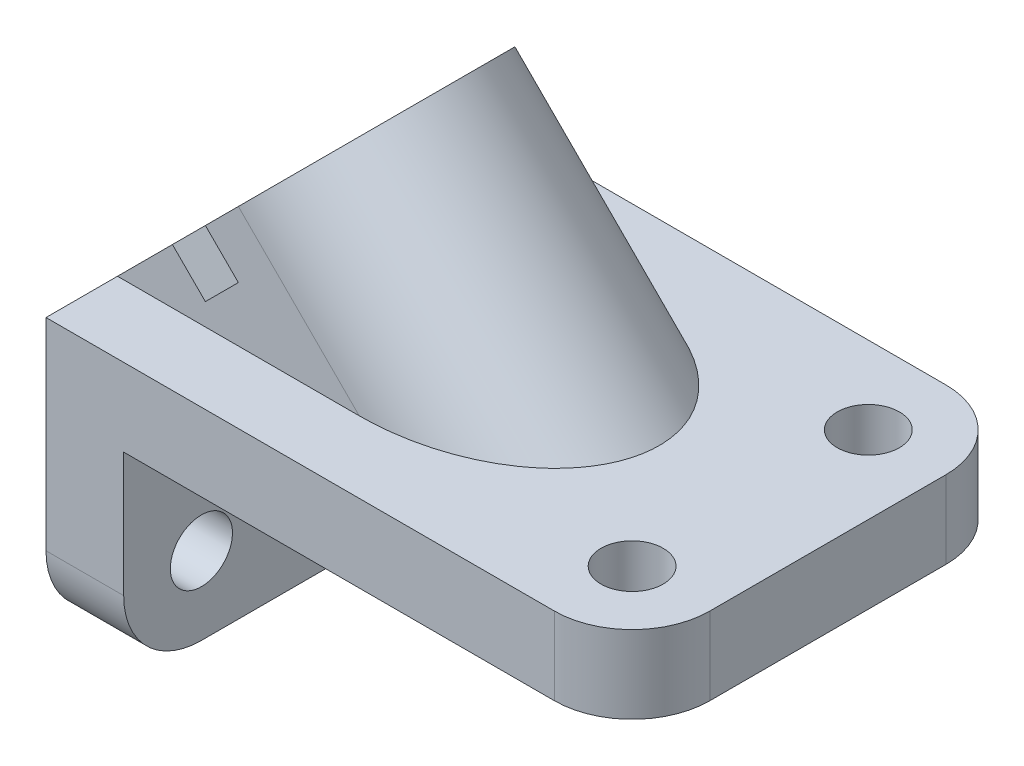
ISO-10303-21;
HEADER;
FILE_DESCRIPTION(('STEP AP214'),'2;1');
FILE_NAME('part.step','',(''),(''),'','','');
FILE_SCHEMA(('AUTOMOTIVE_DESIGN { 1 0 10303 214 1 1 1 1 }'));
ENDSEC;
DATA;
#1=APPLICATION_CONTEXT('core data for automotive mechanical design processes');
#2=APPLICATION_PROTOCOL_DEFINITION('international standard','automotive_design',2000,#1);
#3=PRODUCT_CONTEXT('',#1,'mechanical');
#4=PRODUCT('Part','Part','',(#3));
#5=PRODUCT_RELATED_PRODUCT_CATEGORY('part','',(#4));
#6=PRODUCT_DEFINITION_FORMATION('','',#4);
#7=PRODUCT_DEFINITION_CONTEXT('part definition',#1,'design');
#8=PRODUCT_DEFINITION('design','',#6,#7);
#9=PRODUCT_DEFINITION_SHAPE('','',#8);
#10=(LENGTH_UNIT() NAMED_UNIT(*) SI_UNIT(.MILLI.,.METRE.));
#11=(NAMED_UNIT(*) PLANE_ANGLE_UNIT() SI_UNIT($,.RADIAN.));
#12=(NAMED_UNIT(*) SI_UNIT($,.STERADIAN.) SOLID_ANGLE_UNIT());
#13=UNCERTAINTY_MEASURE_WITH_UNIT(LENGTH_MEASURE(1.E-05),#10,'distance_accuracy_value','');
#14=(GEOMETRIC_REPRESENTATION_CONTEXT(3) GLOBAL_UNCERTAINTY_ASSIGNED_CONTEXT((#13)) GLOBAL_UNIT_ASSIGNED_CONTEXT((#10,
#11,#12)) REPRESENTATION_CONTEXT('',''));
#15=CARTESIAN_POINT('',(0.,0.,0.));
#16=DIRECTION('',(0.,0.,1.));
#17=DIRECTION('',(1.,0.,0.));
#18=AXIS2_PLACEMENT_3D('',#15,#16,#17);
#19=CARTESIAN_POINT('',(-100.212765957447,0.,40.));
#20=DIRECTION('',(0.707106781186544,-0.707106781186551,0.));
#21=DIRECTION('',(0.707106781186551,0.707106781186544,0.));
#22=AXIS2_PLACEMENT_3D('',#19,#20,#21);
#23=PLANE('',#22);
#24=CARTESIAN_POINT('',(-47.1797573684554,53.0330085889908,0.));
#25=DIRECTION('',(-0.707106781186544,0.707106781186551,0.));
#26=DIRECTION('',(-0.707106781186551,-0.707106781186544,0.));
#27=AXIS2_PLACEMENT_3D('',#24,#25,#26);
#28=CIRCLE('',#27,15.);
#29=CARTESIAN_POINT('',(-57.7863590862537,42.4264068711926,0.));
#30=VERTEX_POINT('',#29);
#31=EDGE_CURVE('E319',#30,#30,#28,.T.);
#32=ORIENTED_EDGE('',*,*,#31,.F.);
#33=EDGE_LOOP('',(#32));
#34=FACE_BOUND('',#33,.T.);
#35=DIRECTION('',(-0.707106781186551,-0.707106781186544,0.));
#36=VECTOR('',#35,1.);
#37=CARTESIAN_POINT('',(-100.212765957447,0.,-40.));
#38=LINE('',#37,#36);
#39=CARTESIAN_POINT('',(-61.3218929921865,38.8908729652599,-40.));
#40=VERTEX_POINT('',#39);
#41=CARTESIAN_POINT('',(-71.9284947099848,28.2842712474618,-40.));
#42=VERTEX_POINT('',#41);
#43=EDGE_CURVE('E189',#40,#42,#38,.T.);
#44=ORIENTED_EDGE('',*,*,#43,.T.);
#45=DIRECTION('',(0.,0.,1.));
#46=VECTOR('',#45,1.);
#47=CARTESIAN_POINT('',(-71.9284947099848,28.2842712474618,-50.));
#48=LINE('',#47,#46);
#49=CARTESIAN_POINT('',(-71.9284947099848,28.2842712474618,40.));
#50=VERTEX_POINT('',#49);
#51=EDGE_CURVE('E321',#42,#50,#48,.T.);
#52=ORIENTED_EDGE('',*,*,#51,.T.);
#53=DIRECTION('',(-0.707106781186551,-0.707106781186544,0.));
#54=VECTOR('',#53,1.);
#55=CARTESIAN_POINT('',(-100.212765957447,0.,40.));
#56=LINE('',#55,#54);
#57=CARTESIAN_POINT('',(-61.3218929921865,38.8908729652599,40.));
#58=VERTEX_POINT('',#57);
#59=EDGE_CURVE('E176',#58,#50,#56,.T.);
#60=ORIENTED_EDGE('',*,*,#59,.F.);
#61=CARTESIAN_POINT('',(-61.3218929921865,38.8908729652599,0.));
#62=DIRECTION('',(-0.707106781186544,0.707106781186551,0.));
#63=DIRECTION('',(-0.707106781186551,-0.707106781186544,0.));
#64=AXIS2_PLACEMENT_3D('',#61,#62,#63);
#65=CIRCLE('',#64,40.);
#66=EDGE_CURVE('E313',#58,#40,#65,.T.);
#67=ORIENTED_EDGE('',*,*,#66,.T.);
#68=EDGE_LOOP('',(#44,#52,#60,#67));
#69=FACE_BOUND('',#68,.T.);
#70=ADVANCED_FACE('F33',(#34,#69),#23,.F.);
#71=CARTESIAN_POINT('',(-100.212765957447,-90.,63.));
#72=DIRECTION('',(0.,1.,0.));
#73=DIRECTION('',(0.,0.,1.));
#74=AXIS2_PLACEMENT_3D('',#71,#72,#73);
#75=PLANE('',#74);
#76=DIRECTION('',(0.,0.,-1.));
#77=VECTOR('',#76,1.);
#78=CARTESIAN_POINT('',(-100.212765957447,-90.,63.));
#79=LINE('',#78,#77);
#80=CARTESIAN_POINT('',(-100.212765957447,-90.,38.));
#81=VERTEX_POINT('',#80);
#82=CARTESIAN_POINT('',(-100.212765957447,-90.,-38.));
#83=VERTEX_POINT('',#82);
#84=EDGE_CURVE('E223',#81,#83,#79,.T.);
#85=ORIENTED_EDGE('',*,*,#84,.T.);
#86=DIRECTION('',(1.,0.,0.));
#87=VECTOR('',#86,1.);
#88=CARTESIAN_POINT('',(-100.212765957447,-90.,-38.));
#89=LINE('',#88,#87);
#90=CARTESIAN_POINT('',(-75.2127659574468,-90.,-38.));
#91=VERTEX_POINT('',#90);
#92=EDGE_CURVE('E255',#83,#91,#89,.T.);
#93=ORIENTED_EDGE('',*,*,#92,.T.);
#94=DIRECTION('',(0.,0.,-1.));
#95=VECTOR('',#94,1.);
#96=CARTESIAN_POINT('',(-75.2127659574468,-90.,63.));
#97=LINE('',#96,#95);
#98=CARTESIAN_POINT('',(-75.2127659574468,-90.,38.));
#99=VERTEX_POINT('',#98);
#100=EDGE_CURVE('E250',#99,#91,#97,.T.);
#101=ORIENTED_EDGE('',*,*,#100,.F.);
#102=DIRECTION('',(1.,0.,0.));
#103=VECTOR('',#102,1.);
#104=CARTESIAN_POINT('',(-100.212765957447,-90.,38.));
#105=LINE('',#104,#103);
#106=EDGE_CURVE('E253',#99,#81,#105,.F.);
#107=ORIENTED_EDGE('',*,*,#106,.T.);
#108=EDGE_LOOP('',(#85,#93,#101,#107));
#109=FACE_BOUND('',#108,.T.);
#110=ADVANCED_FACE('F347',(#109),#75,.F.);
#111=CARTESIAN_POINT('',(-75.2127659574468,-90.,63.));
#112=DIRECTION('',(-1.,0.,0.));
#113=DIRECTION('',(0.,0.,1.));
#114=AXIS2_PLACEMENT_3D('',#111,#112,#113);
#115=PLANE('',#114);
#116=CARTESIAN_POINT('',(-75.2127659574468,-65.,-38.));
#117=DIRECTION('',(-1.,0.,0.));
#118=DIRECTION('',(0.,0.,1.));
#119=AXIS2_PLACEMENT_3D('',#116,#117,#118);
#120=CIRCLE('',#119,10.);
#121=CARTESIAN_POINT('',(-75.2127659574468,-65.,-28.));
#122=VERTEX_POINT('',#121);
#123=EDGE_CURVE('E202',#122,#122,#120,.T.);
#124=ORIENTED_EDGE('',*,*,#123,.T.);
#125=EDGE_LOOP('',(#124));
#126=FACE_BOUND('',#125,.T.);
#127=CARTESIAN_POINT('',(-75.2127659574468,-65.,38.));
#128=DIRECTION('',(-1.,0.,0.));
#129=DIRECTION('',(0.,0.,1.));
#130=AXIS2_PLACEMENT_3D('',#127,#128,#129);
#131=CIRCLE('',#130,10.);
#132=CARTESIAN_POINT('',(-75.2127659574468,-65.,48.));
#133=VERTEX_POINT('',#132);
#134=EDGE_CURVE('E197',#133,#133,#131,.T.);
#135=ORIENTED_EDGE('',*,*,#134,.T.);
#136=EDGE_LOOP('',(#135));
#137=FACE_BOUND('',#136,.T.);
#138=ORIENTED_EDGE('',*,*,#100,.T.);
#139=CARTESIAN_POINT('',(-75.2127659574468,-65.,-38.));
#140=DIRECTION('',(-1.,0.,0.));
#141=DIRECTION('',(0.,0.,1.));
#142=AXIS2_PLACEMENT_3D('',#139,#140,#141);
#143=CIRCLE('',#142,25.);
#144=CARTESIAN_POINT('',(-75.2127659574468,-65.,-63.));
#145=VERTEX_POINT('',#144);
#146=EDGE_CURVE('E260',#91,#145,#143,.F.);
#147=ORIENTED_EDGE('',*,*,#146,.T.);
#148=DIRECTION('',(0.,1.,0.));
#149=VECTOR('',#148,1.);
#150=CARTESIAN_POINT('',(-75.2127659574468,-90.,-63.));
#151=LINE('',#150,#149);
#152=CARTESIAN_POINT('',(-75.2127659574468,-25.,-63.));
#153=VERTEX_POINT('',#152);
#154=EDGE_CURVE('E224',#145,#153,#151,.T.);
#155=ORIENTED_EDGE('',*,*,#154,.T.);
#156=DIRECTION('',(0.,0.,-1.));
#157=VECTOR('',#156,1.);
#158=CARTESIAN_POINT('',(-75.2127659574468,-25.,63.));
#159=LINE('',#158,#157);
#160=CARTESIAN_POINT('',(-75.2127659574468,-25.,63.));
#161=VERTEX_POINT('',#160);
#162=EDGE_CURVE('E247',#161,#153,#159,.T.);
#163=ORIENTED_EDGE('',*,*,#162,.F.);
#164=DIRECTION('',(0.,1.,0.));
#165=VECTOR('',#164,1.);
#166=CARTESIAN_POINT('',(-75.2127659574468,-90.,63.));
#167=LINE('',#166,#165);
#168=CARTESIAN_POINT('',(-75.2127659574468,-65.,63.));
#169=VERTEX_POINT('',#168);
#170=EDGE_CURVE('E212',#169,#161,#167,.T.);
#171=ORIENTED_EDGE('',*,*,#170,.F.);
#172=CARTESIAN_POINT('',(-75.2127659574468,-65.,38.));
#173=DIRECTION('',(-1.,0.,0.));
#174=DIRECTION('',(0.,0.,1.));
#175=AXIS2_PLACEMENT_3D('',#172,#173,#174);
#176=CIRCLE('',#175,25.);
#177=EDGE_CURVE('E258',#169,#99,#176,.F.);
#178=ORIENTED_EDGE('',*,*,#177,.T.);
#179=EDGE_LOOP('',(#138,#147,#155,#163,#171,#178));
#180=FACE_BOUND('',#179,.T.);
#181=ADVANCED_FACE('F353',(#126,#137,#180),#115,.F.);
#182=CARTESIAN_POINT('',(-75.2127659574468,-25.,63.));
#183=DIRECTION('',(0.,1.,0.));
#184=DIRECTION('',(0.,0.,1.));
#185=AXIS2_PLACEMENT_3D('',#182,#183,#184);
#186=PLANE('',#185);
#187=CARTESIAN_POINT('',(30.8532512205345,-25.,0.));
#188=DIRECTION('',(0.,1.,0.));
#189=DIRECTION('',(-1.,0.,0.));
#190=AXIS2_PLACEMENT_3D('',#187,#188,#189);
#191=ELLIPSE('',#190,21.2132034355963,15.);
#192=CARTESIAN_POINT('',(9.64004778493821,-25.,0.));
#193=VERTEX_POINT('',#192);
#194=EDGE_CURVE('E316',#193,#193,#191,.T.);
#195=ORIENTED_EDGE('',*,*,#194,.T.);
#196=EDGE_LOOP('',(#195));
#197=FACE_BOUND('',#196,.T.);
#198=CARTESIAN_POINT('',(63.3720886884021,-25.,-38.));
#199=DIRECTION('',(0.,-1.,0.));
#200=DIRECTION('',(0.,0.,-1.));
#201=AXIS2_PLACEMENT_3D('',#198,#199,#200);
#202=CIRCLE('',#201,10.);
#203=CARTESIAN_POINT('',(63.3720886884021,-25.,-48.));
#204=VERTEX_POINT('',#203);
#205=EDGE_CURVE('E206',#204,#204,#202,.T.);
#206=ORIENTED_EDGE('',*,*,#205,.F.);
#207=EDGE_LOOP('',(#206));
#208=FACE_BOUND('',#207,.T.);
#209=CARTESIAN_POINT('',(63.3720886884021,-25.,38.));
#210=DIRECTION('',(0.,-1.,0.));
#211=DIRECTION('',(0.,0.,-1.));
#212=AXIS2_PLACEMENT_3D('',#209,#210,#211);
#213=CIRCLE('',#212,10.);
#214=CARTESIAN_POINT('',(63.3720886884021,-25.,28.));
#215=VERTEX_POINT('',#214);
#216=EDGE_CURVE('E205',#215,#215,#213,.T.);
#217=ORIENTED_EDGE('',*,*,#216,.F.);
#218=EDGE_LOOP('',(#217));
#219=FACE_BOUND('',#218,.T.);
#220=DIRECTION('',(1.,0.,0.));
#221=VECTOR('',#220,1.);
#222=CARTESIAN_POINT('',(-75.2127659574468,-25.,-63.));
#223=LINE('',#222,#221);
#224=CARTESIAN_POINT('',(63.3720886884021,-25.,-63.));
#225=VERTEX_POINT('',#224);
#226=EDGE_CURVE('E226',#153,#225,#223,.T.);
#227=ORIENTED_EDGE('',*,*,#226,.T.);
#228=CARTESIAN_POINT('',(63.3720886884021,-25.,-38.));
#229=DIRECTION('',(0.,1.,0.));
#230=DIRECTION('',(0.,0.,1.));
#231=AXIS2_PLACEMENT_3D('',#228,#229,#230);
#232=CIRCLE('',#231,25.);
#233=CARTESIAN_POINT('',(88.3720886884021,-25.,-38.));
#234=VERTEX_POINT('',#233);
#235=EDGE_CURVE('E287',#225,#234,#232,.F.);
#236=ORIENTED_EDGE('',*,*,#235,.T.);
#237=DIRECTION('',(0.,0.,-1.));
#238=VECTOR('',#237,1.);
#239=CARTESIAN_POINT('',(88.3720886884021,-25.,63.));
#240=LINE('',#239,#238);
#241=CARTESIAN_POINT('',(88.3720886884021,-25.,38.));
#242=VERTEX_POINT('',#241);
#243=EDGE_CURVE('E244',#242,#234,#240,.T.);
#244=ORIENTED_EDGE('',*,*,#243,.F.);
#245=CARTESIAN_POINT('',(63.3720886884021,-25.,38.));
#246=DIRECTION('',(0.,1.,0.));
#247=DIRECTION('',(0.,0.,1.));
#248=AXIS2_PLACEMENT_3D('',#245,#246,#247);
#249=CIRCLE('',#248,25.);
#250=CARTESIAN_POINT('',(63.3720886884021,-25.,63.));
#251=VERTEX_POINT('',#250);
#252=EDGE_CURVE('E285',#242,#251,#249,.F.);
#253=ORIENTED_EDGE('',*,*,#252,.T.);
#254=DIRECTION('',(1.,0.,0.));
#255=VECTOR('',#254,1.);
#256=CARTESIAN_POINT('',(-75.2127659574468,-25.,63.));
#257=LINE('',#256,#255);
#258=EDGE_CURVE('E214',#161,#251,#257,.T.);
#259=ORIENTED_EDGE('',*,*,#258,.F.);
#260=ORIENTED_EDGE('',*,*,#162,.T.);
#261=EDGE_LOOP('',(#227,#236,#244,#253,#259,#260));
#262=FACE_BOUND('',#261,.T.);
#263=ADVANCED_FACE('F399',(#197,#208,#219,#262),#186,.F.);
#264=CARTESIAN_POINT('',(88.3720886884021,-25.,63.));
#265=DIRECTION('',(-1.,0.,0.));
#266=DIRECTION('',(0.,0.,1.));
#267=AXIS2_PLACEMENT_3D('',#264,#265,#266);
#268=PLANE('',#267);
#269=ORIENTED_EDGE('',*,*,#243,.T.);
#270=DIRECTION('',(0.,1.,0.));
#271=VECTOR('',#270,1.);
#272=CARTESIAN_POINT('',(88.3720886884021,-25.,-38.));
#273=LINE('',#272,#271);
#274=CARTESIAN_POINT('',(88.3720886884021,0.,-38.));
#275=VERTEX_POINT('',#274);
#276=EDGE_CURVE('E278',#234,#275,#273,.T.);
#277=ORIENTED_EDGE('',*,*,#276,.T.);
#278=DIRECTION('',(0.,0.,-1.));
#279=VECTOR('',#278,1.);
#280=CARTESIAN_POINT('',(88.3720886884021,0.,63.));
#281=LINE('',#280,#279);
#282=CARTESIAN_POINT('',(88.3720886884021,0.,38.));
#283=VERTEX_POINT('',#282);
#284=EDGE_CURVE('E241',#283,#275,#281,.T.);
#285=ORIENTED_EDGE('',*,*,#284,.F.);
#286=DIRECTION('',(0.,1.,0.));
#287=VECTOR('',#286,1.);
#288=CARTESIAN_POINT('',(88.3720886884021,-25.,38.));
#289=LINE('',#288,#287);
#290=EDGE_CURVE('E276',#283,#242,#289,.F.);
#291=ORIENTED_EDGE('',*,*,#290,.T.);
#292=EDGE_LOOP('',(#269,#277,#285,#291));
#293=FACE_BOUND('',#292,.T.);
#294=ADVANCED_FACE('F395',(#293),#268,.F.);
#295=CARTESIAN_POINT('',(-100.212765957447,0.,63.));
#296=DIRECTION('',(0.,-1.,0.));
#297=DIRECTION('',(0.,0.,-1.));
#298=AXIS2_PLACEMENT_3D('',#295,#296,#297);
#299=PLANE('',#298);
#300=CARTESIAN_POINT('',(63.3720886884021,0.,-38.));
#301=DIRECTION('',(0.,-1.,0.));
#302=DIRECTION('',(0.,0.,-1.));
#303=AXIS2_PLACEMENT_3D('',#300,#301,#302);
#304=CIRCLE('',#303,10.);
#305=CARTESIAN_POINT('',(63.3720886884021,0.,-48.));
#306=VERTEX_POINT('',#305);
#307=EDGE_CURVE('E227',#306,#306,#304,.T.);
#308=ORIENTED_EDGE('',*,*,#307,.T.);
#309=EDGE_LOOP('',(#308));
#310=FACE_BOUND('',#309,.T.);
#311=CARTESIAN_POINT('',(63.3720886884021,0.,38.));
#312=DIRECTION('',(0.,-1.,0.));
#313=DIRECTION('',(0.,0.,-1.));
#314=AXIS2_PLACEMENT_3D('',#311,#312,#313);
#315=CIRCLE('',#314,10.);
#316=CARTESIAN_POINT('',(63.3720886884021,0.,28.));
#317=VERTEX_POINT('',#316);
#318=EDGE_CURVE('E209',#317,#317,#315,.T.);
#319=ORIENTED_EDGE('',*,*,#318,.T.);
#320=EDGE_LOOP('',(#319));
#321=FACE_BOUND('',#320,.T.);
#322=DIRECTION('',(1.,0.,0.));
#323=VECTOR('',#322,1.);
#324=CARTESIAN_POINT('',(-22.4310200269256,0.,-40.));
#325=LINE('',#324,#323);
#326=CARTESIAN_POINT('',(-100.212765957447,0.,-40.));
#327=VERTEX_POINT('',#326);
#328=CARTESIAN_POINT('',(-22.4310200269256,0.,-40.));
#329=VERTEX_POINT('',#328);
#330=EDGE_CURVE('E56',#327,#329,#325,.T.);
#331=ORIENTED_EDGE('',*,*,#330,.T.);
#332=CARTESIAN_POINT('',(-22.431020026927,0.,0.));
#333=DIRECTION('',(0.,-1.,0.));
#334=DIRECTION('',(-1.,0.,0.));
#335=AXIS2_PLACEMENT_3D('',#332,#333,#334);
#336=ELLIPSE('',#335,56.5685424949235,40.);
#337=CARTESIAN_POINT('',(-22.4310200269256,0.,40.));
#338=VERTEX_POINT('',#337);
#339=EDGE_CURVE('E185',#338,#329,#336,.F.);
#340=ORIENTED_EDGE('',*,*,#339,.F.);
#341=DIRECTION('',(1.,0.,0.));
#342=VECTOR('',#341,1.);
#343=CARTESIAN_POINT('',(-22.4310200269256,0.,40.));
#344=LINE('',#343,#342);
#345=CARTESIAN_POINT('',(-100.212765957447,0.,40.));
#346=VERTEX_POINT('',#345);
#347=EDGE_CURVE('E179',#346,#338,#344,.T.);
#348=ORIENTED_EDGE('',*,*,#347,.F.);
#349=DIRECTION('',(0.,0.,-1.));
#350=VECTOR('',#349,1.);
#351=CARTESIAN_POINT('',(-100.212765957447,0.,63.));
#352=LINE('',#351,#350);
#353=CARTESIAN_POINT('',(-100.212765957447,0.,63.));
#354=VERTEX_POINT('',#353);
#355=EDGE_CURVE('E238',#354,#346,#352,.T.);
#356=ORIENTED_EDGE('',*,*,#355,.F.);
#357=DIRECTION('',(-1.,0.,0.));
#358=VECTOR('',#357,1.);
#359=CARTESIAN_POINT('',(-100.212765957447,0.,63.));
#360=LINE('',#359,#358);
#361=CARTESIAN_POINT('',(63.3720886884021,0.,63.));
#362=VERTEX_POINT('',#361);
#363=EDGE_CURVE('E218',#362,#354,#360,.T.);
#364=ORIENTED_EDGE('',*,*,#363,.F.);
#365=CARTESIAN_POINT('',(63.3720886884021,0.,38.));
#366=DIRECTION('',(0.,-1.,0.));
#367=DIRECTION('',(0.,0.,-1.));
#368=AXIS2_PLACEMENT_3D('',#365,#366,#367);
#369=CIRCLE('',#368,25.);
#370=EDGE_CURVE('E281',#362,#283,#369,.F.);
#371=ORIENTED_EDGE('',*,*,#370,.T.);
#372=ORIENTED_EDGE('',*,*,#284,.T.);
#373=CARTESIAN_POINT('',(63.3720886884021,0.,-38.));
#374=DIRECTION('',(0.,-1.,0.));
#375=DIRECTION('',(0.,0.,-1.));
#376=AXIS2_PLACEMENT_3D('',#373,#374,#375);
#377=CIRCLE('',#376,25.);
#378=CARTESIAN_POINT('',(63.3720886884021,0.,-63.));
#379=VERTEX_POINT('',#378);
#380=EDGE_CURVE('E283',#275,#379,#377,.F.);
#381=ORIENTED_EDGE('',*,*,#380,.T.);
#382=DIRECTION('',(-1.,0.,0.));
#383=VECTOR('',#382,1.);
#384=CARTESIAN_POINT('',(-100.212765957447,0.,-63.));
#385=LINE('',#384,#383);
#386=CARTESIAN_POINT('',(-100.212765957447,0.,-63.));
#387=VERTEX_POINT('',#386);
#388=EDGE_CURVE('E230',#379,#387,#385,.T.);
#389=ORIENTED_EDGE('',*,*,#388,.T.);
#390=EDGE_CURVE('E237',#327,#387,#352,.T.);
#391=ORIENTED_EDGE('',*,*,#390,.F.);
#392=EDGE_LOOP('',(#331,#340,#348,#356,#364,#371,#372,#381,#389,#391));
#393=FACE_BOUND('',#392,.T.);
#394=ADVANCED_FACE('F301',(#310,#321,#393),#299,.F.);
#395=CARTESIAN_POINT('',(-100.212765957447,-90.,63.));
#396=DIRECTION('',(1.,0.,0.));
#397=DIRECTION('',(0.,0.,-1.));
#398=AXIS2_PLACEMENT_3D('',#395,#396,#397);
#399=PLANE('',#398);
#400=CARTESIAN_POINT('',(-100.212765957447,-65.,-38.));
#401=DIRECTION('',(-1.,0.,0.));
#402=DIRECTION('',(0.,0.,1.));
#403=AXIS2_PLACEMENT_3D('',#400,#401,#402);
#404=CIRCLE('',#403,10.);
#405=CARTESIAN_POINT('',(-100.212765957447,-65.,-28.));
#406=VERTEX_POINT('',#405);
#407=EDGE_CURVE('E194',#406,#406,#404,.T.);
#408=ORIENTED_EDGE('',*,*,#407,.F.);
#409=EDGE_LOOP('',(#408));
#410=FACE_BOUND('',#409,.T.);
#411=CARTESIAN_POINT('',(-100.212765957447,-65.,38.));
#412=DIRECTION('',(-1.,0.,0.));
#413=DIRECTION('',(0.,0.,1.));
#414=AXIS2_PLACEMENT_3D('',#411,#412,#413);
#415=CIRCLE('',#414,10.);
#416=CARTESIAN_POINT('',(-100.212765957447,-65.,48.));
#417=VERTEX_POINT('',#416);
#418=EDGE_CURVE('E193',#417,#417,#415,.T.);
#419=ORIENTED_EDGE('',*,*,#418,.F.);
#420=EDGE_LOOP('',(#419));
#421=FACE_BOUND('',#420,.T.);
#422=DIRECTION('',(0.,-1.,0.));
#423=VECTOR('',#422,1.);
#424=CARTESIAN_POINT('',(-100.212765957447,-90.,-63.));
#425=LINE('',#424,#423);
#426=CARTESIAN_POINT('',(-100.212765957447,-65.,-63.));
#427=VERTEX_POINT('',#426);
#428=EDGE_CURVE('E215',#387,#427,#425,.T.);
#429=ORIENTED_EDGE('',*,*,#428,.T.);
#430=CARTESIAN_POINT('',(-100.212765957447,-65.,-38.));
#431=DIRECTION('',(1.,0.,0.));
#432=DIRECTION('',(0.,0.,-1.));
#433=AXIS2_PLACEMENT_3D('',#430,#431,#432);
#434=CIRCLE('',#433,25.);
#435=EDGE_CURVE('E268',#427,#83,#434,.F.);
#436=ORIENTED_EDGE('',*,*,#435,.T.);
#437=ORIENTED_EDGE('',*,*,#84,.F.);
#438=CARTESIAN_POINT('',(-100.212765957447,-65.,38.));
#439=DIRECTION('',(1.,0.,0.));
#440=DIRECTION('',(0.,0.,-1.));
#441=AXIS2_PLACEMENT_3D('',#438,#439,#440);
#442=CIRCLE('',#441,25.);
#443=CARTESIAN_POINT('',(-100.212765957447,-65.,63.));
#444=VERTEX_POINT('',#443);
#445=EDGE_CURVE('E266',#81,#444,#442,.F.);
#446=ORIENTED_EDGE('',*,*,#445,.T.);
#447=DIRECTION('',(0.,-1.,0.));
#448=VECTOR('',#447,1.);
#449=CARTESIAN_POINT('',(-100.212765957447,-90.,63.));
#450=LINE('',#449,#448);
#451=EDGE_CURVE('E220',#354,#444,#450,.T.);
#452=ORIENTED_EDGE('',*,*,#451,.F.);
#453=ORIENTED_EDGE('',*,*,#355,.T.);
#454=DIRECTION('',(0.,0.,-1.));
#455=VECTOR('',#454,1.);
#456=CARTESIAN_POINT('',(-100.212765957447,0.,40.));
#457=LINE('',#456,#455);
#458=EDGE_CURVE('E175',#346,#327,#457,.T.);
#459=ORIENTED_EDGE('',*,*,#458,.T.);
#460=ORIENTED_EDGE('',*,*,#390,.T.);
#461=EDGE_LOOP('',(#429,#436,#437,#446,#452,#453,#459,#460));
#462=FACE_BOUND('',#461,.T.);
#463=ADVANCED_FACE('F305',(#410,#421,#462),#399,.F.);
#464=CARTESIAN_POINT('',(0.,0.,63.));
#465=DIRECTION('',(0.,0.,1.));
#466=DIRECTION('',(1.,0.,0.));
#467=AXIS2_PLACEMENT_3D('',#464,#465,#466);
#468=PLANE('',#467);
#469=ORIENTED_EDGE('',*,*,#451,.T.);
#470=DIRECTION('',(1.,0.,0.));
#471=VECTOR('',#470,1.);
#472=CARTESIAN_POINT('',(-75.2127659574468,-65.,63.));
#473=LINE('',#472,#471);
#474=EDGE_CURVE('E273',#444,#169,#473,.T.);
#475=ORIENTED_EDGE('',*,*,#474,.T.);
#476=ORIENTED_EDGE('',*,*,#170,.T.);
#477=ORIENTED_EDGE('',*,*,#258,.T.);
#478=DIRECTION('',(0.,1.,0.));
#479=VECTOR('',#478,1.);
#480=CARTESIAN_POINT('',(63.3720886884021,0.,63.));
#481=LINE('',#480,#479);
#482=EDGE_CURVE('E270',#251,#362,#481,.T.);
#483=ORIENTED_EDGE('',*,*,#482,.T.);
#484=ORIENTED_EDGE('',*,*,#363,.T.);
#485=EDGE_LOOP('',(#469,#475,#476,#477,#483,#484));
#486=FACE_BOUND('',#485,.T.);
#487=ADVANCED_FACE('F381',(#486),#468,.T.);
#488=CARTESIAN_POINT('',(0.,0.,-63.));
#489=DIRECTION('',(0.,0.,1.));
#490=DIRECTION('',(1.,0.,0.));
#491=AXIS2_PLACEMENT_3D('',#488,#489,#490);
#492=PLANE('',#491);
#493=ORIENTED_EDGE('',*,*,#154,.F.);
#494=DIRECTION('',(1.,0.,0.));
#495=VECTOR('',#494,1.);
#496=CARTESIAN_POINT('',(0.,-65.,-63.));
#497=LINE('',#496,#495);
#498=EDGE_CURVE('E264',#145,#427,#497,.F.);
#499=ORIENTED_EDGE('',*,*,#498,.T.);
#500=ORIENTED_EDGE('',*,*,#428,.F.);
#501=ORIENTED_EDGE('',*,*,#388,.F.);
#502=DIRECTION('',(0.,1.,0.));
#503=VECTOR('',#502,1.);
#504=CARTESIAN_POINT('',(63.3720886884021,0.,-63.));
#505=LINE('',#504,#503);
#506=EDGE_CURVE('E262',#379,#225,#505,.F.);
#507=ORIENTED_EDGE('',*,*,#506,.T.);
#508=ORIENTED_EDGE('',*,*,#226,.F.);
#509=EDGE_LOOP('',(#493,#499,#500,#501,#507,#508));
#510=FACE_BOUND('',#509,.T.);
#511=ADVANCED_FACE('F384',(#510),#492,.F.);
#512=CARTESIAN_POINT('',(-100.212765957447,-65.,-38.));
#513=DIRECTION('',(1.,0.,0.));
#514=DIRECTION('',(0.,0.,-1.));
#515=AXIS2_PLACEMENT_3D('',#512,#513,#514);
#516=CYLINDRICAL_SURFACE('',#515,25.);
#517=ORIENTED_EDGE('',*,*,#435,.F.);
#518=ORIENTED_EDGE('',*,*,#498,.F.);
#519=ORIENTED_EDGE('',*,*,#146,.F.);
#520=ORIENTED_EDGE('',*,*,#92,.F.);
#521=EDGE_LOOP('',(#517,#518,#519,#520));
#522=FACE_BOUND('',#521,.T.);
#523=ADVANCED_FACE('F388',(#522),#516,.T.);
#524=CARTESIAN_POINT('',(0.,-65.,38.));
#525=DIRECTION('',(-1.,0.,0.));
#526=DIRECTION('',(0.,0.,1.));
#527=AXIS2_PLACEMENT_3D('',#524,#525,#526);
#528=CYLINDRICAL_SURFACE('',#527,25.);
#529=ORIENTED_EDGE('',*,*,#445,.F.);
#530=ORIENTED_EDGE('',*,*,#106,.F.);
#531=ORIENTED_EDGE('',*,*,#177,.F.);
#532=ORIENTED_EDGE('',*,*,#474,.F.);
#533=EDGE_LOOP('',(#529,#530,#531,#532));
#534=FACE_BOUND('',#533,.T.);
#535=ADVANCED_FACE('F409',(#534),#528,.T.);
#536=CARTESIAN_POINT('',(63.3720886884021,-25.,-38.));
#537=DIRECTION('',(0.,1.,0.));
#538=DIRECTION('',(0.,0.,1.));
#539=AXIS2_PLACEMENT_3D('',#536,#537,#538);
#540=CYLINDRICAL_SURFACE('',#539,25.);
#541=ORIENTED_EDGE('',*,*,#235,.F.);
#542=ORIENTED_EDGE('',*,*,#506,.F.);
#543=ORIENTED_EDGE('',*,*,#380,.F.);
#544=ORIENTED_EDGE('',*,*,#276,.F.);
#545=EDGE_LOOP('',(#541,#542,#543,#544));
#546=FACE_BOUND('',#545,.T.);
#547=ADVANCED_FACE('F412',(#546),#540,.T.);
#548=CARTESIAN_POINT('',(63.3720886884021,0.,38.));
#549=DIRECTION('',(0.,-1.,0.));
#550=DIRECTION('',(0.,0.,-1.));
#551=AXIS2_PLACEMENT_3D('',#548,#549,#550);
#552=CYLINDRICAL_SURFACE('',#551,25.);
#553=ORIENTED_EDGE('',*,*,#252,.F.);
#554=ORIENTED_EDGE('',*,*,#290,.F.);
#555=ORIENTED_EDGE('',*,*,#370,.F.);
#556=ORIENTED_EDGE('',*,*,#482,.F.);
#557=EDGE_LOOP('',(#553,#554,#555,#556));
#558=FACE_BOUND('',#557,.T.);
#559=ADVANCED_FACE('F35',(#558),#552,.T.);
#560=CARTESIAN_POINT('',(63.3720886884021,101.,38.));
#561=DIRECTION('',(0.,-1.,0.));
#562=DIRECTION('',(0.,0.,-1.));
#563=AXIS2_PLACEMENT_3D('',#560,#561,#562);
#564=CYLINDRICAL_SURFACE('',#563,10.);
#565=ORIENTED_EDGE('',*,*,#216,.T.);
#566=EDGE_LOOP('',(#565));
#567=FACE_BOUND('',#566,.T.);
#568=ORIENTED_EDGE('',*,*,#318,.F.);
#569=EDGE_LOOP('',(#568));
#570=FACE_BOUND('',#569,.T.);
#571=ADVANCED_FACE('F376',(#567,#570),#564,.F.);
#572=CARTESIAN_POINT('',(63.3720886884021,101.,-38.));
#573=DIRECTION('',(0.,-1.,0.));
#574=DIRECTION('',(0.,0.,-1.));
#575=AXIS2_PLACEMENT_3D('',#572,#573,#574);
#576=CYLINDRICAL_SURFACE('',#575,10.);
#577=ORIENTED_EDGE('',*,*,#205,.T.);
#578=EDGE_LOOP('',(#577));
#579=FACE_BOUND('',#578,.T.);
#580=ORIENTED_EDGE('',*,*,#307,.F.);
#581=EDGE_LOOP('',(#580));
#582=FACE_BOUND('',#581,.T.);
#583=ADVANCED_FACE('F369',(#579,#582),#576,.F.);
#584=CARTESIAN_POINT('',(25.7872340425532,-65.,38.));
#585=DIRECTION('',(-1.,0.,0.));
#586=DIRECTION('',(0.,0.,1.));
#587=AXIS2_PLACEMENT_3D('',#584,#585,#586);
#588=CYLINDRICAL_SURFACE('',#587,10.);
#589=ORIENTED_EDGE('',*,*,#418,.T.);
#590=EDGE_LOOP('',(#589));
#591=FACE_BOUND('',#590,.T.);
#592=ORIENTED_EDGE('',*,*,#134,.F.);
#593=EDGE_LOOP('',(#592));
#594=FACE_BOUND('',#593,.T.);
#595=ADVANCED_FACE('F364',(#591,#594),#588,.F.);
#596=CARTESIAN_POINT('',(25.7872340425532,-65.,-38.));
#597=DIRECTION('',(-1.,0.,0.));
#598=DIRECTION('',(0.,0.,1.));
#599=AXIS2_PLACEMENT_3D('',#596,#597,#598);
#600=CYLINDRICAL_SURFACE('',#599,10.);
#601=ORIENTED_EDGE('',*,*,#407,.T.);
#602=EDGE_LOOP('',(#601));
#603=FACE_BOUND('',#602,.T.);
#604=ORIENTED_EDGE('',*,*,#123,.F.);
#605=EDGE_LOOP('',(#604));
#606=FACE_BOUND('',#605,.T.);
#607=ADVANCED_FACE('F359',(#603,#606),#600,.F.);
#608=CARTESIAN_POINT('',(-82.535096427783,17.6776695296636,40.));
#609=VERTEX_POINT('',#608);
#610=EDGE_CURVE('E166',#609,#346,#56,.T.);
#611=ORIENTED_EDGE('',*,*,#610,.F.);
#612=DIRECTION('',(0.,0.,1.));
#613=VECTOR('',#612,1.);
#614=CARTESIAN_POINT('',(-82.535096427783,17.6776695296636,-50.));
#615=LINE('',#614,#613);
#616=CARTESIAN_POINT('',(-82.535096427783,17.6776695296636,-40.));
#617=VERTEX_POINT('',#616);
#618=EDGE_CURVE('E150',#617,#609,#615,.T.);
#619=ORIENTED_EDGE('',*,*,#618,.F.);
#620=EDGE_CURVE('E188',#617,#327,#38,.T.);
#621=ORIENTED_EDGE('',*,*,#620,.T.);
#622=ORIENTED_EDGE('',*,*,#458,.F.);
#623=EDGE_LOOP('',(#611,#619,#621,#622));
#624=FACE_BOUND('',#623,.T.);
#625=ADVANCED_FACE('F173',(#624),#23,.F.);
#626=CARTESIAN_POINT('',(0.,0.,40.));
#627=DIRECTION('',(0.,0.,-1.));
#628=DIRECTION('',(-1.,0.,0.));
#629=AXIS2_PLACEMENT_3D('',#626,#627,#628);
#630=PLANE('',#629);
#631=ORIENTED_EDGE('',*,*,#59,.T.);
#632=DIRECTION('',(-0.707106781186544,0.707106781186551,0.));
#633=VECTOR('',#632,1.);
#634=CARTESIAN_POINT('',(-61.3218929921866,17.6776695296635,40.));
#635=LINE('',#634,#633);
#636=CARTESIAN_POINT('',(-61.3218929921866,17.6776695296635,40.));
#637=VERTEX_POINT('',#636);
#638=EDGE_CURVE('E160',#637,#50,#635,.T.);
#639=ORIENTED_EDGE('',*,*,#638,.F.);
#640=DIRECTION('',(0.707106781186551,0.707106781186544,0.));
#641=VECTOR('',#640,1.);
#642=CARTESIAN_POINT('',(-71.9284947099848,7.07106781186529,40.));
#643=LINE('',#642,#641);
#644=CARTESIAN_POINT('',(-71.9284947099848,7.07106781186529,40.));
#645=VERTEX_POINT('',#644);
#646=EDGE_CURVE('E170',#645,#637,#643,.T.);
#647=ORIENTED_EDGE('',*,*,#646,.F.);
#648=DIRECTION('',(0.707106781186544,-0.707106781186551,0.));
#649=VECTOR('',#648,1.);
#650=CARTESIAN_POINT('',(-82.535096427783,17.6776695296636,40.));
#651=LINE('',#650,#649);
#652=EDGE_CURVE('E153',#609,#645,#651,.T.);
#653=ORIENTED_EDGE('',*,*,#652,.F.);
#654=ORIENTED_EDGE('',*,*,#610,.T.);
#655=ORIENTED_EDGE('',*,*,#347,.T.);
#656=DIRECTION('',(-0.707106781186557,0.707106781186538,0.));
#657=VECTOR('',#656,1.);
#658=CARTESIAN_POINT('',(-61.3218929921865,38.8908729652599,40.));
#659=LINE('',#658,#657);
#660=EDGE_CURVE('E177',#338,#58,#659,.T.);
#661=ORIENTED_EDGE('',*,*,#660,.T.);
#662=EDGE_LOOP('',(#631,#639,#647,#653,#654,#655,#661));
#663=FACE_BOUND('',#662,.T.);
#664=ADVANCED_FACE('F164',(#663),#630,.F.);
#665=CARTESIAN_POINT('',(0.,0.,-40.));
#666=DIRECTION('',(0.,0.,-1.));
#667=DIRECTION('',(-1.,0.,0.));
#668=AXIS2_PLACEMENT_3D('',#665,#666,#667);
#669=PLANE('',#668);
#670=DIRECTION('',(0.707106781186544,-0.707106781186551,0.));
#671=VECTOR('',#670,1.);
#672=CARTESIAN_POINT('',(-21.8221117312619,-21.8221117312616,-40.));
#673=LINE('',#672,#671);
#674=CARTESIAN_POINT('',(-61.3218929921866,17.6776695296635,-40.));
#675=VERTEX_POINT('',#674);
#676=EDGE_CURVE('E11',#42,#675,#673,.T.);
#677=ORIENTED_EDGE('',*,*,#676,.F.);
#678=ORIENTED_EDGE('',*,*,#43,.F.);
#679=DIRECTION('',(-0.707106781186557,0.707106781186538,0.));
#680=VECTOR('',#679,1.);
#681=CARTESIAN_POINT('',(-61.3218929921865,38.8908729652599,-40.));
#682=LINE('',#681,#680);
#683=EDGE_CURVE('E184',#329,#40,#682,.T.);
#684=ORIENTED_EDGE('',*,*,#683,.F.);
#685=ORIENTED_EDGE('',*,*,#330,.F.);
#686=ORIENTED_EDGE('',*,*,#620,.F.);
#687=DIRECTION('',(-0.707106781186544,0.707106781186551,0.));
#688=VECTOR('',#687,1.);
#689=CARTESIAN_POINT('',(-32.4287134490602,-32.4287134490598,-40.));
#690=LINE('',#689,#688);
#691=CARTESIAN_POINT('',(-71.9284947099848,7.07106781186529,-40.));
#692=VERTEX_POINT('',#691);
#693=EDGE_CURVE('E156',#692,#617,#690,.T.);
#694=ORIENTED_EDGE('',*,*,#693,.F.);
#695=DIRECTION('',(-0.707106781186551,-0.707106781186544,0.));
#696=VECTOR('',#695,1.);
#697=CARTESIAN_POINT('',(-39.4997812609247,39.4997812609251,-40.));
#698=LINE('',#697,#696);
#699=EDGE_CURVE('E41',#675,#692,#698,.T.);
#700=ORIENTED_EDGE('',*,*,#699,.F.);
#701=EDGE_LOOP('',(#677,#678,#684,#685,#686,#694,#700));
#702=FACE_BOUND('',#701,.T.);
#703=ADVANCED_FACE('F300',(#702),#669,.T.);
#704=CARTESIAN_POINT('',(45.4719485442993,-67.902968571227,0.));
#705=DIRECTION('',(-0.707106781186544,0.707106781186551,0.));
#706=DIRECTION('',(-0.707106781186551,-0.707106781186544,0.));
#707=AXIS2_PLACEMENT_3D('',#704,#705,#706);
#708=CYLINDRICAL_SURFACE('',#707,40.);
#709=ORIENTED_EDGE('',*,*,#66,.F.);
#710=ORIENTED_EDGE('',*,*,#660,.F.);
#711=ORIENTED_EDGE('',*,*,#339,.T.);
#712=ORIENTED_EDGE('',*,*,#683,.T.);
#713=EDGE_LOOP('',(#709,#710,#711,#712));
#714=FACE_BOUND('',#713,.T.);
#715=ADVANCED_FACE('F334',(#714),#708,.T.);
#716=CARTESIAN_POINT('',(92.112669954468,-86.2594187339341,0.));
#717=DIRECTION('',(-0.707106781186544,0.707106781186551,0.));
#718=DIRECTION('',(-0.707106781186551,-0.707106781186544,0.));
#719=AXIS2_PLACEMENT_3D('',#716,#717,#718);
#720=CYLINDRICAL_SURFACE('',#719,15.);
#721=ORIENTED_EDGE('',*,*,#31,.T.);
#722=EDGE_LOOP('',(#721));
#723=FACE_BOUND('',#722,.T.);
#724=ORIENTED_EDGE('',*,*,#194,.F.);
#725=EDGE_LOOP('',(#724));
#726=FACE_BOUND('',#725,.T.);
#727=ADVANCED_FACE('F336',(#723,#726),#720,.F.);
#728=CARTESIAN_POINT('',(-61.3218929921866,17.6776695296635,-50.));
#729=DIRECTION('',(0.707106781186551,0.707106781186544,0.));
#730=DIRECTION('',(-0.707106781186544,0.707106781186551,0.));
#731=AXIS2_PLACEMENT_3D('',#728,#729,#730);
#732=PLANE('',#731);
#733=ORIENTED_EDGE('',*,*,#676,.T.);
#734=DIRECTION('',(0.,0.,1.));
#735=VECTOR('',#734,1.);
#736=CARTESIAN_POINT('',(-61.3218929921866,17.6776695296635,-50.));
#737=LINE('',#736,#735);
#738=EDGE_CURVE('E297',#675,#637,#737,.T.);
#739=ORIENTED_EDGE('',*,*,#738,.T.);
#740=ORIENTED_EDGE('',*,*,#638,.T.);
#741=ORIENTED_EDGE('',*,*,#51,.F.);
#742=EDGE_LOOP('',(#733,#739,#740,#741));
#743=FACE_BOUND('',#742,.T.);
#744=ADVANCED_FACE('F330',(#743),#732,.F.);
#745=CARTESIAN_POINT('',(-71.9284947099848,7.07106781186529,-50.));
#746=DIRECTION('',(0.707106781186544,-0.707106781186551,0.));
#747=DIRECTION('',(0.707106781186551,0.707106781186544,0.));
#748=AXIS2_PLACEMENT_3D('',#745,#746,#747);
#749=PLANE('',#748);
#750=ORIENTED_EDGE('',*,*,#699,.T.);
#751=DIRECTION('',(0.,0.,1.));
#752=VECTOR('',#751,1.);
#753=CARTESIAN_POINT('',(-71.9284947099848,7.07106781186529,-50.));
#754=LINE('',#753,#752);
#755=EDGE_CURVE('E48',#692,#645,#754,.T.);
#756=ORIENTED_EDGE('',*,*,#755,.T.);
#757=ORIENTED_EDGE('',*,*,#646,.T.);
#758=ORIENTED_EDGE('',*,*,#738,.F.);
#759=EDGE_LOOP('',(#750,#756,#757,#758));
#760=FACE_BOUND('',#759,.T.);
#761=ADVANCED_FACE('F296',(#760),#749,.F.);
#762=CARTESIAN_POINT('',(-82.535096427783,17.6776695296636,-50.));
#763=DIRECTION('',(-0.707106781186551,-0.707106781186544,0.));
#764=DIRECTION('',(0.707106781186544,-0.707106781186551,0.));
#765=AXIS2_PLACEMENT_3D('',#762,#763,#764);
#766=PLANE('',#765);
#767=ORIENTED_EDGE('',*,*,#693,.T.);
#768=ORIENTED_EDGE('',*,*,#618,.T.);
#769=ORIENTED_EDGE('',*,*,#652,.T.);
#770=ORIENTED_EDGE('',*,*,#755,.F.);
#771=EDGE_LOOP('',(#767,#768,#769,#770));
#772=FACE_BOUND('',#771,.T.);
#773=ADVANCED_FACE('F152',(#772),#766,.F.);
#774=CLOSED_SHELL('',(#70,#110,#181,#263,#294,#394,#463,#487,#511,#523,#535,#547,#559,#571,#583,
#595,#607,#625,#664,#703,#715,#727,#744,#761,#773));
#775=MANIFOLD_SOLID_BREP('B2',#774);
#776=ADVANCED_BREP_SHAPE_REPRESENTATION('',(#18,#775),#14);
#777=SHAPE_DEFINITION_REPRESENTATION(#9,#776);
ENDSEC;
END-ISO-10303-21;
